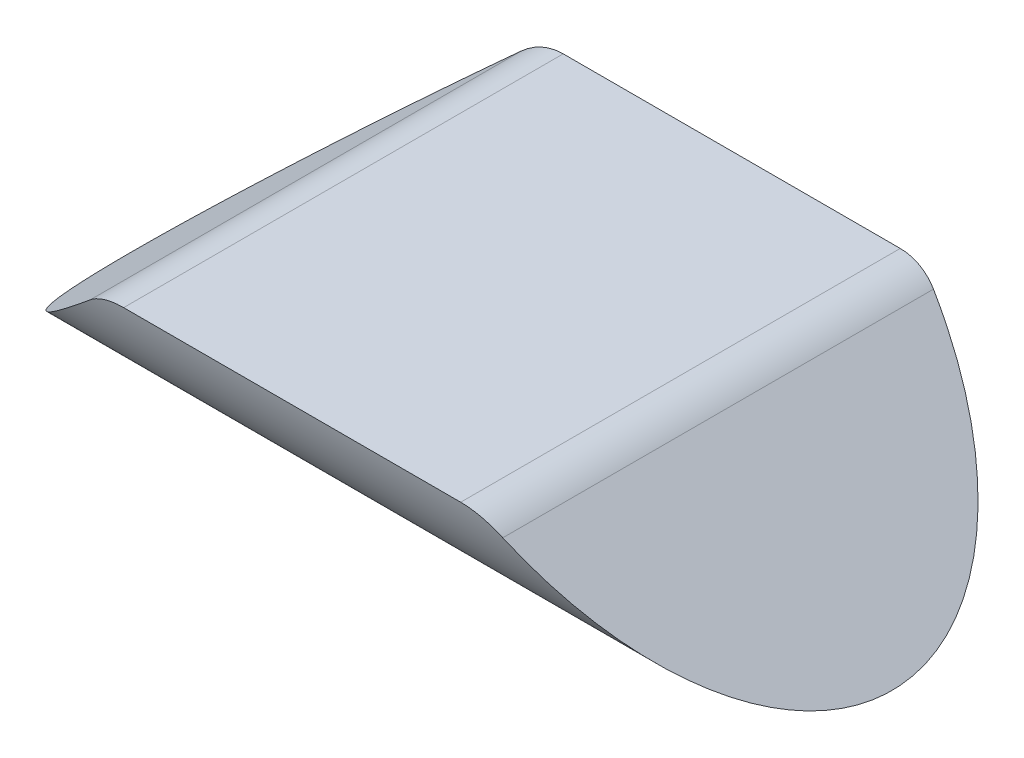
ISO-10303-21;
HEADER;
FILE_DESCRIPTION(('STEP AP214'),'2;1');
FILE_NAME('part.step','',(''),(''),'','','');
FILE_SCHEMA(('AUTOMOTIVE_DESIGN { 1 0 10303 214 1 1 1 1 }'));
ENDSEC;
DATA;
#1=APPLICATION_CONTEXT('core data for automotive mechanical design processes');
#2=APPLICATION_PROTOCOL_DEFINITION('international standard','automotive_design',2000,#1);
#3=PRODUCT_CONTEXT('',#1,'mechanical');
#4=PRODUCT('Part','Part','',(#3));
#5=PRODUCT_RELATED_PRODUCT_CATEGORY('part','',(#4));
#6=PRODUCT_DEFINITION_FORMATION('','',#4);
#7=PRODUCT_DEFINITION_CONTEXT('part definition',#1,'design');
#8=PRODUCT_DEFINITION('design','',#6,#7);
#9=PRODUCT_DEFINITION_SHAPE('','',#8);
#10=(LENGTH_UNIT() NAMED_UNIT(*) SI_UNIT(.MILLI.,.METRE.));
#11=(NAMED_UNIT(*) PLANE_ANGLE_UNIT() SI_UNIT($,.RADIAN.));
#12=(NAMED_UNIT(*) SI_UNIT($,.STERADIAN.) SOLID_ANGLE_UNIT());
#13=UNCERTAINTY_MEASURE_WITH_UNIT(LENGTH_MEASURE(1.E-05),#10,'distance_accuracy_value','');
#14=(GEOMETRIC_REPRESENTATION_CONTEXT(3) GLOBAL_UNCERTAINTY_ASSIGNED_CONTEXT((#13)) GLOBAL_UNIT_ASSIGNED_CONTEXT((#10,
#11,#12)) REPRESENTATION_CONTEXT('',''));
#15=CARTESIAN_POINT('',(0.,0.,0.));
#16=DIRECTION('',(0.,0.,1.));
#17=DIRECTION('',(1.,0.,0.));
#18=AXIS2_PLACEMENT_3D('',#15,#16,#17);
#19=CARTESIAN_POINT('',(127.,0.,0.));
#20=DIRECTION('',(-1.,0.,0.));
#21=DIRECTION('',(0.,0.,1.));
#22=AXIS2_PLACEMENT_3D('',#19,#20,#21);
#23=CYLINDRICAL_SURFACE('',#22,76.2);
#24=DIRECTION('',(-1.,0.,0.));
#25=VECTOR('',#24,1.);
#26=CARTESIAN_POINT('',(127.,-20.32,-73.4407080575889));
#27=LINE('',#26,#25);
#28=CARTESIAN_POINT('',(56.3115244007405,-20.32,-73.4407080575889));
#29=VERTEX_POINT('',#28);
#30=CARTESIAN_POINT('',(-56.3115244007405,-20.32,-73.4407080575889));
#31=VERTEX_POINT('',#30);
#32=EDGE_CURVE('E201',#29,#31,#27,.T.);
#33=ORIENTED_EDGE('',*,*,#32,.F.);
#34=CARTESIAN_POINT('',(56.3115244007405,-20.32,-73.4407080575889));
#35=CARTESIAN_POINT('',(56.5700300316652,-20.3199991554033,-73.4407063359609));
#36=CARTESIAN_POINT('',(56.8285068692522,-20.3252625194358,-73.4392522302459));
#37=CARTESIAN_POINT('',(57.3449933709856,-20.3462977918162,-73.4334279449559));
#38=CARTESIAN_POINT('',(57.6030030463425,-20.3620694445554,-73.4290578363111));
#39=CARTESIAN_POINT('',(58.3756196292876,-20.4251079297358,-73.4115590749349));
#40=CARTESIAN_POINT('',(58.8889310985459,-20.4880983076445,-73.3940419959211));
#41=CARTESIAN_POINT('',(59.9085459181511,-20.6555396830979,-73.3470942027149));
#42=CARTESIAN_POINT('',(60.4148443763769,-20.7600182495076,-73.3176555664));
#43=CARTESIAN_POINT('',(61.1659162184489,-20.9470794237377,-73.2643432188116));
#44=CARTESIAN_POINT('',(61.4148825050259,-21.0144920494826,-73.2450462183593));
#45=CARTESIAN_POINT('',(61.9096992011996,-21.1593050646107,-73.2033434518041));
#46=CARTESIAN_POINT('',(62.1555487973612,-21.2367080047689,-73.180936891643));
#47=CARTESIAN_POINT('',(62.8879148651462,-21.4837192599353,-73.1089553677631));
#48=CARTESIAN_POINT('',(63.3690781785711,-21.6680874998351,-73.0546305428251));
#49=CARTESIAN_POINT('',(64.3135040794081,-22.0744775645498,-72.9328620778276));
#50=CARTESIAN_POINT('',(64.776766727245,-22.2964992622499,-72.8654184820558));
#51=CARTESIAN_POINT('',(65.4553064640745,-22.655959058814,-72.7541282211962));
#52=CARTESIAN_POINT('',(65.6785787479972,-22.7800674413941,-72.7153810237203));
#53=CARTESIAN_POINT('',(66.1194358324064,-23.0368299196799,-72.6344449693006));
#54=CARTESIAN_POINT('',(66.3370219237689,-23.1694820516768,-72.5922569026222));
#55=CARTESIAN_POINT('',(66.9806094084258,-23.5797588645024,-72.4604543853985));
#56=CARTESIAN_POINT('',(67.3977311739668,-23.869858442782,-72.3655541843622));
#57=CARTESIAN_POINT('',(67.9900014033369,-24.317701229711,-72.2157325643111));
#58=CARTESIAN_POINT('',(68.1756868803434,-24.4636329764668,-72.1664429477341));
#59=CARTESIAN_POINT('',(68.5407785815588,-24.7616711283959,-72.0647237133339));
#60=CARTESIAN_POINT('',(68.7201917406196,-24.9137702849992,-72.012297749068));
#61=CARTESIAN_POINT('',(68.8964857984335,-25.0689075026215,-71.9582509280555));
#62=B_SPLINE_CURVE_WITH_KNOTS('',3,(#34,#35,#36,#37,#38,#39,#40,#41,#42,#43,#44,#45,#46,#47,#48,
#49,#50,#51,#52,#53,#54,#55,#56,#57,#58,#59,#60,#61),.UNSPECIFIED.,.F.,.F.,(4,2,2,2,2,2,2,2,2,2,
2,2,2,4),(0.,0.775401755467531,1.55078465037207,3.10120056928607,4.65264846686549,
5.42840398235091,6.20435796075182,7.75679239890763,9.30922159628545,10.0841266728021,
10.8588542751337,12.4073134809147,13.1309404636671,13.8537403093022),.UNSPECIFIED.);
#63=CARTESIAN_POINT('',(68.8964857984335,-25.0689075026215,-71.9582509280555));
#64=VERTEX_POINT('',#63);
#65=EDGE_CURVE('E97',#29,#64,#62,.T.);
#66=ORIENTED_EDGE('',*,*,#65,.T.);
#67=CARTESIAN_POINT('',(40.4090909090909,0.,0.));
#68=DIRECTION('',(0.660627894892025,0.750713516922755,0.));
#69=DIRECTION('',(-0.750713516922755,0.660627894892025,0.));
#70=AXIS2_PLACEMENT_3D('',#67,#68,#69);
#71=ELLIPSE('',#70,115.344811487947,76.2);
#72=CARTESIAN_POINT('',(68.8964857984335,-25.0689075026215,71.9582509280555));
#73=VERTEX_POINT('',#72);
#74=EDGE_CURVE('E102',#73,#64,#71,.T.);
#75=ORIENTED_EDGE('',*,*,#74,.F.);
#76=CARTESIAN_POINT('',(68.8964857984335,-25.0689075026215,71.9582509280555));
#77=CARTESIAN_POINT('',(68.7064542501679,-24.9016785081498,72.0165103712882));
#78=CARTESIAN_POINT('',(68.5127854519955,-24.7379734106293,72.0728884396596));
#79=CARTESIAN_POINT('',(68.118430385301,-24.417944457579,72.1819407291992));
#80=CARTESIAN_POINT('',(67.9177440441064,-24.2616206785282,72.2346149119936));
#81=CARTESIAN_POINT('',(67.305615092634,-23.8042750176876,72.3871520859349));
#82=CARTESIAN_POINT('',(66.8840420341254,-23.5148254865147,72.4815481690505));
#83=CARTESIAN_POINT('',(66.0162823982986,-22.969289875495,72.6562726062024));
#84=CARTESIAN_POINT('',(65.5700619251986,-22.7132514556661,72.7365809194179));
#85=CARTESIAN_POINT('',(64.6565907722593,-22.2373547959698,72.8834829377334));
#86=CARTESIAN_POINT('',(64.1893418060932,-22.0174936146887,72.9500777579287));
#87=CARTESIAN_POINT('',(63.2366164349324,-21.6157567148279,73.0701244943568));
#88=CARTESIAN_POINT('',(62.751122593231,-21.4339184832271,73.1235634492858));
#89=CARTESIAN_POINT('',(61.7657137088763,-21.1101173924322,73.2176987135927));
#90=CARTESIAN_POINT('',(61.2657962544859,-20.9681612449332,73.2583928783014));
#91=CARTESIAN_POINT('',(60.2564618946426,-20.7257313441812,73.3273476315661));
#92=CARTESIAN_POINT('',(59.7470707423129,-20.6251585940407,73.3556379033363));
#93=CARTESIAN_POINT('',(58.7214840405937,-20.4659362421299,73.4002203277552));
#94=CARTESIAN_POINT('',(58.2052925881303,-20.4072624774118,73.4165193958391));
#95=CARTESIAN_POINT('',(57.4585424680954,-20.3531744547465,73.4315226030949));
#96=CARTESIAN_POINT('',(57.2291968767097,-20.3407293276696,73.4349700272801));
#97=CARTESIAN_POINT('',(56.7704180495646,-20.3241466960878,73.4395609779635));
#98=CARTESIAN_POINT('',(56.5409851449127,-20.3200006846576,73.4407068636348));
#99=CARTESIAN_POINT('',(56.3115244007405,-20.32,73.4407080575889));
#100=B_SPLINE_CURVE_WITH_KNOTS('',3,(#76,#77,#78,#79,#80,#81,#82,#83,#84,#85,#86,#87,#88,#89,
#90,#91,#92,#93,#94,#95,#96,#97,#98,#99),.UNSPECIFIED.,.F.,.F.,(4,2,2,2,2,2,2,2,2,2,2,4),(0.,
0.779143026024567,1.55829412311673,3.116348855589,4.67660236416525,6.2367289525701,
7.79838649844045,9.36030669607524,10.9184684540224,12.475730900133,13.1647238035012,
13.853010099203),.UNSPECIFIED.);
#101=CARTESIAN_POINT('',(56.3115244007405,-20.32,73.4407080575889));
#102=VERTEX_POINT('',#101);
#103=EDGE_CURVE('E88',#73,#102,#100,.T.);
#104=ORIENTED_EDGE('',*,*,#103,.T.);
#105=DIRECTION('',(-1.,0.,0.));
#106=VECTOR('',#105,1.);
#107=CARTESIAN_POINT('',(127.,-20.32,73.4407080575889));
#108=LINE('',#107,#106);
#109=CARTESIAN_POINT('',(-56.3115244007405,-20.32,73.4407080575889));
#110=VERTEX_POINT('',#109);
#111=EDGE_CURVE('E52',#102,#110,#108,.T.);
#112=ORIENTED_EDGE('',*,*,#111,.T.);
#113=CARTESIAN_POINT('',(-56.3115244007405,-20.32,73.4407080575889));
#114=CARTESIAN_POINT('',(-56.5700300316653,-20.3199991554033,73.4407063359609));
#115=CARTESIAN_POINT('',(-56.8285068692523,-20.3252625194358,73.439252230246));
#116=CARTESIAN_POINT('',(-57.3449933709856,-20.3462977918162,73.4334279449559));
#117=CARTESIAN_POINT('',(-57.6030030463425,-20.3620694445554,73.4290578363111));
#118=CARTESIAN_POINT('',(-58.3756196292876,-20.4251079297358,73.4115590749349));
#119=CARTESIAN_POINT('',(-58.8889310985459,-20.4880983076444,73.3940419959211));
#120=CARTESIAN_POINT('',(-59.9085459181511,-20.6555396830979,73.3470942027149));
#121=CARTESIAN_POINT('',(-60.4148443763769,-20.7600182495076,73.3176555664));
#122=CARTESIAN_POINT('',(-61.1659162184489,-20.9470794237377,73.2643432188116));
#123=CARTESIAN_POINT('',(-61.4148825050259,-21.0144920494826,73.2450462183593));
#124=CARTESIAN_POINT('',(-61.9096992011996,-21.1593050646107,73.2033434518041));
#125=CARTESIAN_POINT('',(-62.1555487973612,-21.2367080047689,73.180936891643));
#126=CARTESIAN_POINT('',(-62.8879148651463,-21.4837192599353,73.1089553677631));
#127=CARTESIAN_POINT('',(-63.3690781785711,-21.6680874998351,73.0546305428251));
#128=CARTESIAN_POINT('',(-64.3135040794081,-22.0744775645498,72.9328620778276));
#129=CARTESIAN_POINT('',(-64.776766727245,-22.2964992622499,72.8654184820558));
#130=CARTESIAN_POINT('',(-65.4553064640745,-22.655959058814,72.7541282211962));
#131=CARTESIAN_POINT('',(-65.6785787479972,-22.7800674413941,72.7153810237203));
#132=CARTESIAN_POINT('',(-66.1194358324064,-23.0368299196799,72.6344449693006));
#133=CARTESIAN_POINT('',(-66.3370219237689,-23.1694820516767,72.5922569026222));
#134=CARTESIAN_POINT('',(-66.9806094084258,-23.5797588645024,72.4604543853985));
#135=CARTESIAN_POINT('',(-67.3977311739668,-23.869858442782,72.3655541843622));
#136=CARTESIAN_POINT('',(-67.9900014033369,-24.317701229711,72.2157325643111));
#137=CARTESIAN_POINT('',(-68.1756868803434,-24.4636329764667,72.1664429477341));
#138=CARTESIAN_POINT('',(-68.5407785815588,-24.7616711283959,72.0647237133339));
#139=CARTESIAN_POINT('',(-68.7201917406196,-24.9137702849992,72.012297749068));
#140=CARTESIAN_POINT('',(-68.8964857984336,-25.0689075026215,71.9582509280556));
#141=B_SPLINE_CURVE_WITH_KNOTS('',3,(#113,#114,#115,#116,#117,#118,#119,#120,#121,#122,#123,
#124,#125,#126,#127,#128,#129,#130,#131,#132,#133,#134,#135,#136,#137,#138,#139,#140),
.UNSPECIFIED.,.F.,.F.,(4,2,2,2,2,2,2,2,2,2,2,2,2,4),(0.,0.775401755467531,1.55078465037206,
3.10120056928607,4.65264846686548,5.42840398235091,6.20435796075181,7.75679239890763,
9.30922159628543,10.084126672802,10.8588542751337,12.4073134809147,13.1309404636671,
13.8537403093022),.UNSPECIFIED.);
#142=CARTESIAN_POINT('',(-68.8964857984335,-25.0689075026215,71.9582509280555));
#143=VERTEX_POINT('',#142);
#144=EDGE_CURVE('E67',#110,#143,#141,.T.);
#145=ORIENTED_EDGE('',*,*,#144,.T.);
#146=CARTESIAN_POINT('',(-40.4090909090909,0.,0.));
#147=DIRECTION('',(0.660627894892025,-0.750713516922755,0.));
#148=DIRECTION('',(-0.750713516922755,-0.660627894892025,0.));
#149=AXIS2_PLACEMENT_3D('',#146,#147,#148);
#150=ELLIPSE('',#149,115.344811487947,76.2);
#151=CARTESIAN_POINT('',(-68.8964857984335,-25.0689075026215,-71.9582509280555));
#152=VERTEX_POINT('',#151);
#153=EDGE_CURVE('E11',#143,#152,#150,.T.);
#154=ORIENTED_EDGE('',*,*,#153,.T.);
#155=CARTESIAN_POINT('',(-68.8964857984335,-25.0689075026215,-71.9582509280555));
#156=CARTESIAN_POINT('',(-68.7064542501679,-24.9016785081498,-72.0165103712882));
#157=CARTESIAN_POINT('',(-68.5127854519955,-24.7379734106293,-72.0728884396596));
#158=CARTESIAN_POINT('',(-68.118430385301,-24.417944457579,-72.1819407291992));
#159=CARTESIAN_POINT('',(-67.9177440441064,-24.2616206785282,-72.2346149119936));
#160=CARTESIAN_POINT('',(-67.305615092634,-23.8042750176876,-72.3871520859349));
#161=CARTESIAN_POINT('',(-66.8840420341254,-23.5148254865147,-72.4815481690505));
#162=CARTESIAN_POINT('',(-66.0162823982986,-22.969289875495,-72.6562726062024));
#163=CARTESIAN_POINT('',(-65.5700619251986,-22.7132514556661,-72.7365809194179));
#164=CARTESIAN_POINT('',(-64.6565907722593,-22.2373547959698,-72.8834829377334));
#165=CARTESIAN_POINT('',(-64.1893418060932,-22.0174936146887,-72.9500777579288));
#166=CARTESIAN_POINT('',(-63.2366164349324,-21.6157567148279,-73.0701244943568));
#167=CARTESIAN_POINT('',(-62.751122593231,-21.4339184832271,-73.1235634492858));
#168=CARTESIAN_POINT('',(-61.7657137088763,-21.1101173924322,-73.2176987135927));
#169=CARTESIAN_POINT('',(-61.2657962544859,-20.9681612449332,-73.2583928783014));
#170=CARTESIAN_POINT('',(-60.2564618946426,-20.7257313441812,-73.3273476315661));
#171=CARTESIAN_POINT('',(-59.7470707423129,-20.6251585940407,-73.3556379033363));
#172=CARTESIAN_POINT('',(-58.7214840405937,-20.4659362421299,-73.4002203277552));
#173=CARTESIAN_POINT('',(-58.2052925881303,-20.4072624774118,-73.4165193958391));
#174=CARTESIAN_POINT('',(-57.4585424680954,-20.3531744547465,-73.4315226030949));
#175=CARTESIAN_POINT('',(-57.2291968767097,-20.3407293276696,-73.4349700272801));
#176=CARTESIAN_POINT('',(-56.7704180495646,-20.3241466960878,-73.4395609779635));
#177=CARTESIAN_POINT('',(-56.5409851449127,-20.3200006846576,-73.4407068636348));
#178=CARTESIAN_POINT('',(-56.3115244007405,-20.32,-73.4407080575889));
#179=B_SPLINE_CURVE_WITH_KNOTS('',3,(#155,#156,#157,#158,#159,#160,#161,#162,#163,#164,#165,
#166,#167,#168,#169,#170,#171,#172,#173,#174,#175,#176,#177,#178),.UNSPECIFIED.,.F.,.F.,(4,2,2,
2,2,2,2,2,2,2,2,4),(0.,0.779143026024587,1.55829412311675,3.11634885558901,4.67660236416526,
6.23672895257011,7.79838649844047,9.36030669607526,10.9184684540224,12.475730900133,
13.1647238035012,13.853010099203),.UNSPECIFIED.);
#180=EDGE_CURVE('E129',#152,#31,#179,.T.);
#181=ORIENTED_EDGE('',*,*,#180,.T.);
#182=EDGE_LOOP('',(#33,#66,#75,#104,#112,#145,#154,#181));
#183=FACE_BOUND('',#182,.T.);
#184=ADVANCED_FACE('F48',(#183),#23,.T.);
#185=CARTESIAN_POINT('',(127.,-20.32,73.4407080575889));
#186=DIRECTION('',(0.,-1.,0.));
#187=DIRECTION('',(0.,0.,-1.));
#188=AXIS2_PLACEMENT_3D('',#185,#186,#187);
#189=PLANE('',#188);
#190=ORIENTED_EDGE('',*,*,#111,.F.);
#191=DIRECTION('',(0.,0.,1.));
#192=VECTOR('',#191,1.);
#193=CARTESIAN_POINT('',(56.3115244007405,-20.32,-73.4407080575889));
#194=LINE('',#193,#192);
#195=EDGE_CURVE('E94',#102,#29,#194,.F.);
#196=ORIENTED_EDGE('',*,*,#195,.T.);
#197=ORIENTED_EDGE('',*,*,#32,.T.);
#198=DIRECTION('',(0.,0.,1.));
#199=VECTOR('',#198,1.);
#200=CARTESIAN_POINT('',(-56.3115244007405,-20.32,73.4407080575889));
#201=LINE('',#200,#199);
#202=EDGE_CURVE('E142',#31,#110,#201,.T.);
#203=ORIENTED_EDGE('',*,*,#202,.T.);
#204=EDGE_LOOP('',(#190,#196,#197,#203));
#205=FACE_BOUND('',#204,.T.);
#206=ADVANCED_FACE('F50',(#205),#189,.F.);
#207=CARTESIAN_POINT('',(-127.,-76.2,-73.4407080575889));
#208=DIRECTION('',(0.660627894892025,-0.750713516922755,0.));
#209=DIRECTION('',(0.750713516922755,0.660627894892025,0.));
#210=AXIS2_PLACEMENT_3D('',#207,#208,#209);
#211=PLANE('',#210);
#212=ORIENTED_EDGE('',*,*,#153,.F.);
#213=DIRECTION('',(0.,0.,1.));
#214=VECTOR('',#213,1.);
#215=CARTESIAN_POINT('',(-68.8964857984335,-25.0689075026215,-73.4407080575889));
#216=LINE('',#215,#214);
#217=EDGE_CURVE('E207',#143,#152,#216,.F.);
#218=ORIENTED_EDGE('',*,*,#217,.T.);
#219=EDGE_LOOP('',(#212,#218));
#220=FACE_BOUND('',#219,.T.);
#221=ADVANCED_FACE('F125',(#220),#211,.F.);
#222=CARTESIAN_POINT('',(-56.3115244007405,-39.37,73.4407080575889));
#223=DIRECTION('',(0.,0.,1.));
#224=DIRECTION('',(1.,0.,0.));
#225=AXIS2_PLACEMENT_3D('',#222,#223,#224);
#226=CYLINDRICAL_SURFACE('',#225,19.05);
#227=ORIENTED_EDGE('',*,*,#180,.F.);
#228=ORIENTED_EDGE('',*,*,#217,.F.);
#229=ORIENTED_EDGE('',*,*,#144,.F.);
#230=ORIENTED_EDGE('',*,*,#202,.F.);
#231=EDGE_LOOP('',(#227,#228,#229,#230));
#232=FACE_BOUND('',#231,.T.);
#233=ADVANCED_FACE('F144',(#232),#226,.T.);
#234=CARTESIAN_POINT('',(127.,-76.2,-73.4407080575889));
#235=DIRECTION('',(0.660627894892025,0.750713516922755,0.));
#236=DIRECTION('',(-0.750713516922755,0.660627894892025,0.));
#237=AXIS2_PLACEMENT_3D('',#234,#235,#236);
#238=PLANE('',#237);
#239=ORIENTED_EDGE('',*,*,#74,.T.);
#240=DIRECTION('',(0.,0.,1.));
#241=VECTOR('',#240,1.);
#242=CARTESIAN_POINT('',(68.8964857984335,-25.0689075026215,73.4407080575889));
#243=LINE('',#242,#241);
#244=EDGE_CURVE('E92',#64,#73,#243,.T.);
#245=ORIENTED_EDGE('',*,*,#244,.T.);
#246=EDGE_LOOP('',(#239,#245));
#247=FACE_BOUND('',#246,.T.);
#248=ADVANCED_FACE('F101',(#247),#238,.T.);
#249=CARTESIAN_POINT('',(56.3115244007405,-39.37,-73.4407080575889));
#250=DIRECTION('',(0.,0.,-1.));
#251=DIRECTION('',(-1.,0.,0.));
#252=AXIS2_PLACEMENT_3D('',#249,#250,#251);
#253=CYLINDRICAL_SURFACE('',#252,19.05);
#254=ORIENTED_EDGE('',*,*,#65,.F.);
#255=ORIENTED_EDGE('',*,*,#195,.F.);
#256=ORIENTED_EDGE('',*,*,#103,.F.);
#257=ORIENTED_EDGE('',*,*,#244,.F.);
#258=EDGE_LOOP('',(#254,#255,#256,#257));
#259=FACE_BOUND('',#258,.T.);
#260=ADVANCED_FACE('F91',(#259),#253,.T.);
#261=CLOSED_SHELL('',(#184,#206,#221,#233,#248,#260));
#262=MANIFOLD_SOLID_BREP('B2',#261);
#263=ADVANCED_BREP_SHAPE_REPRESENTATION('',(#18,#262),#14);
#264=SHAPE_DEFINITION_REPRESENTATION(#9,#263);
ENDSEC;
END-ISO-10303-21;
